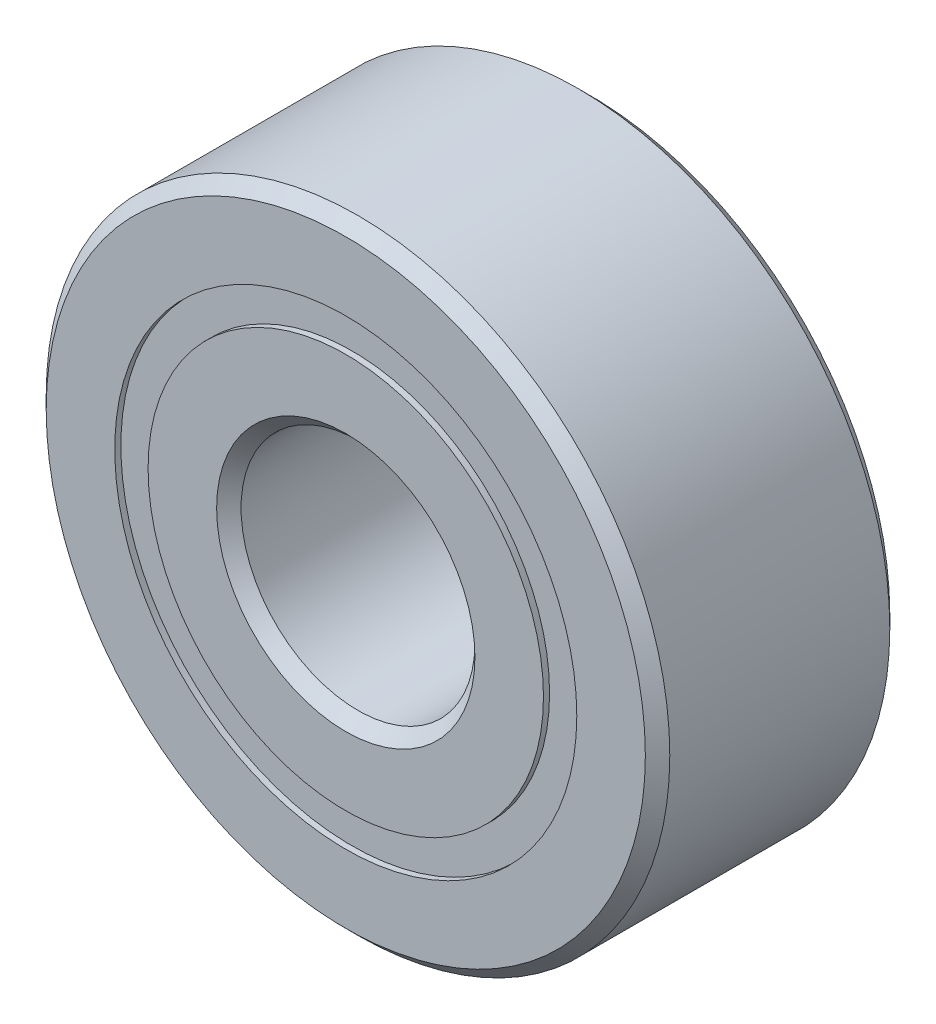
ISO-10303-21;
HEADER;
FILE_DESCRIPTION(('STEP AP214'),'2;1');
FILE_NAME('part.step','',(''),(''),'','','');
FILE_SCHEMA(('AUTOMOTIVE_DESIGN { 1 0 10303 214 1 1 1 1 }'));
ENDSEC;
DATA;
#1=APPLICATION_CONTEXT('core data for automotive mechanical design processes');
#2=APPLICATION_PROTOCOL_DEFINITION('international standard','automotive_design',2000,#1);
#3=PRODUCT_CONTEXT('',#1,'mechanical');
#4=PRODUCT('Part','Part','',(#3));
#5=PRODUCT_RELATED_PRODUCT_CATEGORY('part','',(#4));
#6=PRODUCT_DEFINITION_FORMATION('','',#4);
#7=PRODUCT_DEFINITION_CONTEXT('part definition',#1,'design');
#8=PRODUCT_DEFINITION('design','',#6,#7);
#9=PRODUCT_DEFINITION_SHAPE('','',#8);
#10=(LENGTH_UNIT() NAMED_UNIT(*) SI_UNIT(.MILLI.,.METRE.));
#11=(NAMED_UNIT(*) PLANE_ANGLE_UNIT() SI_UNIT($,.RADIAN.));
#12=(NAMED_UNIT(*) SI_UNIT($,.STERADIAN.) SOLID_ANGLE_UNIT());
#13=UNCERTAINTY_MEASURE_WITH_UNIT(LENGTH_MEASURE(1.E-05),#10,'distance_accuracy_value','');
#14=(GEOMETRIC_REPRESENTATION_CONTEXT(3) GLOBAL_UNCERTAINTY_ASSIGNED_CONTEXT((#13)) GLOBAL_UNIT_ASSIGNED_CONTEXT((#10,
#11,#12)) REPRESENTATION_CONTEXT('',''));
#15=CARTESIAN_POINT('',(0.,0.,0.));
#16=DIRECTION('',(0.,0.,1.));
#17=DIRECTION('',(1.,0.,0.));
#18=AXIS2_PLACEMENT_3D('',#15,#16,#17);
#19=CARTESIAN_POINT('',(0.,4.70503598901099,-2.36474000000001));
#20=DIRECTION('',(0.,0.,1.));
#21=DIRECTION('',(1.,0.,0.));
#22=AXIS2_PLACEMENT_3D('',#19,#20,#21);
#23=PLANE('',#22);
#24=CARTESIAN_POINT('',(0.,0.,-2.36474000000001));
#25=DIRECTION('',(0.,0.,1.));
#26=DIRECTION('',(1.,0.,0.));
#27=AXIS2_PLACEMENT_3D('',#24,#25,#26);
#28=CIRCLE('',#27,4.70503598901099);
#29=CARTESIAN_POINT('',(4.70503598901099,0.,-2.36474000000001));
#30=VERTEX_POINT('',#29);
#31=EDGE_CURVE('E55',#30,#30,#28,.T.);
#32=ORIENTED_EDGE('',*,*,#31,.F.);
#33=EDGE_LOOP('',(#32));
#34=FACE_BOUND('',#33,.T.);
#35=CARTESIAN_POINT('',(0.,0.,-2.36474000000001));
#36=DIRECTION('',(0.,0.,1.));
#37=DIRECTION('',(1.,0.,0.));
#38=AXIS2_PLACEMENT_3D('',#35,#36,#37);
#39=CIRCLE('',#38,4.02621401098901);
#40=CARTESIAN_POINT('',(4.02621401098901,0.,-2.36474000000001));
#41=VERTEX_POINT('',#40);
#42=EDGE_CURVE('E11',#41,#41,#39,.T.);
#43=ORIENTED_EDGE('',*,*,#42,.T.);
#44=EDGE_LOOP('',(#43));
#45=FACE_BOUND('',#44,.T.);
#46=ADVANCED_FACE('F41',(#34,#45),#23,.F.);
#47=CARTESIAN_POINT('',(0.,0.,2.4892));
#48=DIRECTION('',(0.,0.,1.));
#49=DIRECTION('',(1.,0.,0.));
#50=AXIS2_PLACEMENT_3D('',#47,#48,#49);
#51=CYLINDRICAL_SURFACE('',#50,4.02621401098901);
#52=ORIENTED_EDGE('',*,*,#42,.F.);
#53=EDGE_LOOP('',(#52));
#54=FACE_BOUND('',#53,.T.);
#55=CARTESIAN_POINT('',(0.,0.,-1.15720529467736));
#56=DIRECTION('',(0.,0.,1.));
#57=DIRECTION('',(1.,0.,0.));
#58=AXIS2_PLACEMENT_3D('',#55,#56,#57);
#59=CIRCLE('',#58,4.02621401098901);
#60=CARTESIAN_POINT('',(4.02621401098901,0.,-1.15720529467736));
#61=VERTEX_POINT('',#60);
#62=EDGE_CURVE('E47',#61,#61,#59,.T.);
#63=ORIENTED_EDGE('',*,*,#62,.T.);
#64=EDGE_LOOP('',(#63));
#65=FACE_BOUND('',#64,.T.);
#66=ADVANCED_FACE('F64',(#54,#65),#51,.F.);
#67=CARTESIAN_POINT('',(0.,4.70503598901099,-1.15720529467736));
#68=DIRECTION('',(0.,0.,-1.));
#69=DIRECTION('',(-1.,0.,0.));
#70=AXIS2_PLACEMENT_3D('',#67,#68,#69);
#71=PLANE('',#70);
#72=ORIENTED_EDGE('',*,*,#62,.F.);
#73=EDGE_LOOP('',(#72));
#74=FACE_BOUND('',#73,.T.);
#75=CARTESIAN_POINT('',(0.,0.,-1.15720529467736));
#76=DIRECTION('',(0.,0.,1.));
#77=DIRECTION('',(1.,0.,0.));
#78=AXIS2_PLACEMENT_3D('',#75,#76,#77);
#79=CIRCLE('',#78,4.70503598901099);
#80=CARTESIAN_POINT('',(4.70503598901099,0.,-1.15720529467736));
#81=VERTEX_POINT('',#80);
#82=EDGE_CURVE('E51',#81,#81,#79,.T.);
#83=ORIENTED_EDGE('',*,*,#82,.T.);
#84=EDGE_LOOP('',(#83));
#85=FACE_BOUND('',#84,.T.);
#86=ADVANCED_FACE('F68',(#74,#85),#71,.F.);
#87=CARTESIAN_POINT('',(0.,0.,2.4892));
#88=DIRECTION('',(0.,0.,1.));
#89=DIRECTION('',(1.,0.,0.));
#90=AXIS2_PLACEMENT_3D('',#87,#88,#89);
#91=CYLINDRICAL_SURFACE('',#90,4.70503598901099);
#92=ORIENTED_EDGE('',*,*,#82,.F.);
#93=EDGE_LOOP('',(#92));
#94=FACE_BOUND('',#93,.T.);
#95=ORIENTED_EDGE('',*,*,#31,.T.);
#96=EDGE_LOOP('',(#95));
#97=FACE_BOUND('',#96,.T.);
#98=ADVANCED_FACE('F61',(#94,#97),#91,.T.);
#99=CLOSED_SHELL('',(#46,#66,#86,#98));
#100=MANIFOLD_SOLID_BREP('B2',#99);
#101=CARTESIAN_POINT('',(0.,4.70503598901099,2.36474));
#102=DIRECTION('',(0.,0.,-1.));
#103=DIRECTION('',(-1.,0.,0.));
#104=AXIS2_PLACEMENT_3D('',#101,#102,#103);
#105=PLANE('',#104);
#106=CARTESIAN_POINT('',(0.,0.,2.36474));
#107=DIRECTION('',(0.,0.,1.));
#108=DIRECTION('',(1.,0.,0.));
#109=AXIS2_PLACEMENT_3D('',#106,#107,#108);
#110=CIRCLE('',#109,4.02621401098901);
#111=CARTESIAN_POINT('',(4.02621401098901,0.,2.36474));
#112=VERTEX_POINT('',#111);
#113=EDGE_CURVE('E40',#112,#112,#110,.T.);
#114=ORIENTED_EDGE('',*,*,#113,.F.);
#115=EDGE_LOOP('',(#114));
#116=FACE_BOUND('',#115,.T.);
#117=CARTESIAN_POINT('',(0.,0.,2.36474));
#118=DIRECTION('',(0.,0.,1.));
#119=DIRECTION('',(1.,0.,0.));
#120=AXIS2_PLACEMENT_3D('',#117,#118,#119);
#121=CIRCLE('',#120,4.70503598901099);
#122=CARTESIAN_POINT('',(4.70503598901099,0.,2.36474));
#123=VERTEX_POINT('',#122);
#124=EDGE_CURVE('E122',#123,#123,#121,.T.);
#125=ORIENTED_EDGE('',*,*,#124,.T.);
#126=EDGE_LOOP('',(#125));
#127=FACE_BOUND('',#126,.T.);
#128=ADVANCED_FACE('F108',(#116,#127),#105,.F.);
#129=CARTESIAN_POINT('',(0.,0.,2.4892));
#130=DIRECTION('',(0.,0.,1.));
#131=DIRECTION('',(1.,0.,0.));
#132=AXIS2_PLACEMENT_3D('',#129,#130,#131);
#133=CYLINDRICAL_SURFACE('',#132,4.02621401098901);
#134=CARTESIAN_POINT('',(0.,0.,1.15720529467736));
#135=DIRECTION('',(0.,0.,1.));
#136=DIRECTION('',(1.,0.,0.));
#137=AXIS2_PLACEMENT_3D('',#134,#135,#136);
#138=CIRCLE('',#137,4.02621401098901);
#139=CARTESIAN_POINT('',(4.02621401098901,0.,1.15720529467736));
#140=VERTEX_POINT('',#139);
#141=EDGE_CURVE('E114',#140,#140,#138,.T.);
#142=ORIENTED_EDGE('',*,*,#141,.F.);
#143=EDGE_LOOP('',(#142));
#144=FACE_BOUND('',#143,.T.);
#145=ORIENTED_EDGE('',*,*,#113,.T.);
#146=EDGE_LOOP('',(#145));
#147=FACE_BOUND('',#146,.T.);
#148=ADVANCED_FACE('F137',(#144,#147),#133,.F.);
#149=CARTESIAN_POINT('',(0.,4.70503598901099,1.15720529467736));
#150=DIRECTION('',(0.,0.,1.));
#151=DIRECTION('',(1.,0.,0.));
#152=AXIS2_PLACEMENT_3D('',#149,#150,#151);
#153=PLANE('',#152);
#154=CARTESIAN_POINT('',(0.,0.,1.15720529467736));
#155=DIRECTION('',(0.,0.,1.));
#156=DIRECTION('',(1.,0.,0.));
#157=AXIS2_PLACEMENT_3D('',#154,#155,#156);
#158=CIRCLE('',#157,4.70503598901099);
#159=CARTESIAN_POINT('',(4.70503598901099,0.,1.15720529467736));
#160=VERTEX_POINT('',#159);
#161=EDGE_CURVE('E118',#160,#160,#158,.T.);
#162=ORIENTED_EDGE('',*,*,#161,.F.);
#163=EDGE_LOOP('',(#162));
#164=FACE_BOUND('',#163,.T.);
#165=ORIENTED_EDGE('',*,*,#141,.T.);
#166=EDGE_LOOP('',(#165));
#167=FACE_BOUND('',#166,.T.);
#168=ADVANCED_FACE('F132',(#164,#167),#153,.F.);
#169=CARTESIAN_POINT('',(0.,0.,2.4892));
#170=DIRECTION('',(0.,0.,1.));
#171=DIRECTION('',(1.,0.,0.));
#172=AXIS2_PLACEMENT_3D('',#169,#170,#171);
#173=CYLINDRICAL_SURFACE('',#172,4.70503598901099);
#174=ORIENTED_EDGE('',*,*,#124,.F.);
#175=EDGE_LOOP('',(#174));
#176=FACE_BOUND('',#175,.T.);
#177=ORIENTED_EDGE('',*,*,#161,.T.);
#178=EDGE_LOOP('',(#177));
#179=FACE_BOUND('',#178,.T.);
#180=ADVANCED_FACE('F129',(#176,#179),#173,.T.);
#181=CLOSED_SHELL('',(#128,#148,#168,#180));
#182=MANIFOLD_SOLID_BREP('B6',#181);
#183=CARTESIAN_POINT('',(-3.08696304161748,3.08696304161756,0.));
#184=DIRECTION('',(0.,0.,1.));
#185=DIRECTION('',(-0.707106781186539,0.707106781186556,0.));
#186=AXIS2_PLACEMENT_3D('',#183,#184,#185);
#187=SPHERICAL_SURFACE('',#186,1.15720529467736);
#188=CARTESIAN_POINT('',(-3.08696304161748,3.08696304161756,1.15720529467736));
#189=VERTEX_POINT('',#188);
#190=VERTEX_LOOP('',#189);
#191=FACE_BOUND('',#190,.T.);
#192=ADVANCED_FACE('F175',(#191),#187,.T.);
#193=CLOSED_SHELL('',(#192));
#194=MANIFOLD_SOLID_BREP('B35',#193);
#195=CARTESIAN_POINT('',(-4.365625,0.,0.));
#196=DIRECTION('',(0.,0.,1.));
#197=DIRECTION('',(-1.,0.,0.));
#198=AXIS2_PLACEMENT_3D('',#195,#196,#197);
#199=SPHERICAL_SURFACE('',#198,1.15720529467736);
#200=CARTESIAN_POINT('',(-4.365625,0.,1.15720529467736));
#201=VERTEX_POINT('',#200);
#202=VERTEX_LOOP('',#201);
#203=FACE_BOUND('',#202,.T.);
#204=ADVANCED_FACE('F195',(#203),#199,.T.);
#205=CLOSED_SHELL('',(#204));
#206=MANIFOLD_SOLID_BREP('B104',#205);
#207=CARTESIAN_POINT('',(-3.08696304161755,-3.0869630416175,0.));
#208=DIRECTION('',(0.,0.,1.));
#209=DIRECTION('',(-0.707106781186554,-0.707106781186541,0.));
#210=AXIS2_PLACEMENT_3D('',#207,#208,#209);
#211=SPHERICAL_SURFACE('',#210,1.15720529467736);
#212=CARTESIAN_POINT('',(-3.08696304161755,-3.0869630416175,1.15720529467736));
#213=VERTEX_POINT('',#212);
#214=VERTEX_LOOP('',#213);
#215=FACE_BOUND('',#214,.T.);
#216=ADVANCED_FACE('F215',(#215),#211,.T.);
#217=CLOSED_SHELL('',(#216));
#218=MANIFOLD_SOLID_BREP('B171',#217);
#219=CARTESIAN_POINT('',(0.,-4.365625,0.));
#220=DIRECTION('',(0.,0.,1.));
#221=DIRECTION('',(0.,-1.,0.));
#222=AXIS2_PLACEMENT_3D('',#219,#220,#221);
#223=SPHERICAL_SURFACE('',#222,1.15720529467736);
#224=CARTESIAN_POINT('',(0.,-4.365625,1.15720529467736));
#225=VERTEX_POINT('',#224);
#226=VERTEX_LOOP('',#225);
#227=FACE_BOUND('',#226,.T.);
#228=ADVANCED_FACE('F235',(#227),#223,.T.);
#229=CLOSED_SHELL('',(#228));
#230=MANIFOLD_SOLID_BREP('B191',#229);
#231=CARTESIAN_POINT('',(3.08696304161751,-3.08696304161754,0.));
#232=DIRECTION('',(0.,0.,1.));
#233=DIRECTION('',(0.707106781186544,-0.707106781186551,0.));
#234=AXIS2_PLACEMENT_3D('',#231,#232,#233);
#235=SPHERICAL_SURFACE('',#234,1.15720529467736);
#236=CARTESIAN_POINT('',(3.08696304161751,-3.08696304161754,1.15720529467736));
#237=VERTEX_POINT('',#236);
#238=VERTEX_LOOP('',#237);
#239=FACE_BOUND('',#238,.T.);
#240=ADVANCED_FACE('F255',(#239),#235,.T.);
#241=CLOSED_SHELL('',(#240));
#242=MANIFOLD_SOLID_BREP('B211',#241);
#243=CARTESIAN_POINT('',(4.365625,0.,0.));
#244=DIRECTION('',(0.,0.,1.));
#245=DIRECTION('',(1.,0.,0.));
#246=AXIS2_PLACEMENT_3D('',#243,#244,#245);
#247=SPHERICAL_SURFACE('',#246,1.15720529467736);
#248=CARTESIAN_POINT('',(4.365625,0.,1.15720529467736));
#249=VERTEX_POINT('',#248);
#250=VERTEX_LOOP('',#249);
#251=FACE_BOUND('',#250,.T.);
#252=ADVANCED_FACE('F275',(#251),#247,.T.);
#253=CLOSED_SHELL('',(#252));
#254=MANIFOLD_SOLID_BREP('B231',#253);
#255=CARTESIAN_POINT('',(3.08696304161753,3.08696304161752,0.));
#256=DIRECTION('',(0.,0.,1.));
#257=DIRECTION('',(0.707106781186549,0.707106781186546,0.));
#258=AXIS2_PLACEMENT_3D('',#255,#256,#257);
#259=SPHERICAL_SURFACE('',#258,1.15720529467736);
#260=CARTESIAN_POINT('',(3.08696304161753,3.08696304161752,1.15720529467736));
#261=VERTEX_POINT('',#260);
#262=VERTEX_LOOP('',#261);
#263=FACE_BOUND('',#262,.T.);
#264=ADVANCED_FACE('F295',(#263),#259,.T.);
#265=CLOSED_SHELL('',(#264));
#266=MANIFOLD_SOLID_BREP('B251',#265);
#267=CARTESIAN_POINT('',(0.,4.365625,0.));
#268=DIRECTION('',(0.,0.,1.));
#269=DIRECTION('',(0.,1.,0.));
#270=AXIS2_PLACEMENT_3D('',#267,#268,#269);
#271=SPHERICAL_SURFACE('',#270,1.15720529467736);
#272=CARTESIAN_POINT('',(0.,4.365625,1.15720529467736));
#273=VERTEX_POINT('',#272);
#274=VERTEX_LOOP('',#273);
#275=FACE_BOUND('',#274,.T.);
#276=ADVANCED_FACE('F317',(#275),#271,.T.);
#277=CLOSED_SHELL('',(#276));
#278=MANIFOLD_SOLID_BREP('B271',#277);
#279=CARTESIAN_POINT('',(0.,4.02621401098901,2.4892));
#280=DIRECTION('',(0.,0.,-1.));
#281=DIRECTION('',(-1.,0.,0.));
#282=AXIS2_PLACEMENT_3D('',#279,#280,#281);
#283=PLANE('',#282);
#284=CARTESIAN_POINT('',(0.,0.,2.4892));
#285=DIRECTION('',(0.,0.,1.));
#286=DIRECTION('',(1.,0.,0.));
#287=AXIS2_PLACEMENT_3D('',#284,#285,#286);
#288=CIRCLE('',#287,2.63017);
#289=CARTESIAN_POINT('',(2.63017,0.,2.4892));
#290=VERTEX_POINT('',#289);
#291=EDGE_CURVE('E364',#290,#290,#288,.T.);
#292=ORIENTED_EDGE('',*,*,#291,.F.);
#293=EDGE_LOOP('',(#292));
#294=FACE_BOUND('',#293,.T.);
#295=CARTESIAN_POINT('',(0.,0.,2.4892));
#296=DIRECTION('',(0.,0.,1.));
#297=DIRECTION('',(1.,0.,0.));
#298=AXIS2_PLACEMENT_3D('',#295,#296,#297);
#299=CIRCLE('',#298,4.02621401098901);
#300=CARTESIAN_POINT('',(4.02621401098901,0.,2.4892));
#301=VERTEX_POINT('',#300);
#302=EDGE_CURVE('E316',#301,#301,#299,.T.);
#303=ORIENTED_EDGE('',*,*,#302,.T.);
#304=EDGE_LOOP('',(#303));
#305=FACE_BOUND('',#304,.T.);
#306=ADVANCED_FACE('F336',(#294,#305),#283,.F.);
#307=CARTESIAN_POINT('',(0.,0.,2.4892));
#308=DIRECTION('',(0.,0.,1.));
#309=DIRECTION('',(1.,0.,0.));
#310=AXIS2_PLACEMENT_3D('',#307,#308,#309);
#311=CYLINDRICAL_SURFACE('',#310,4.02621401098901);
#312=ORIENTED_EDGE('',*,*,#302,.F.);
#313=EDGE_LOOP('',(#312));
#314=FACE_BOUND('',#313,.T.);
#315=CARTESIAN_POINT('',(0.,0.,1.10631111111111));
#316=DIRECTION('',(0.,0.,1.));
#317=DIRECTION('',(1.,0.,0.));
#318=AXIS2_PLACEMENT_3D('',#315,#316,#317);
#319=CIRCLE('',#318,4.02621401098901);
#320=CARTESIAN_POINT('',(4.02621401098901,0.,1.10631111111111));
#321=VERTEX_POINT('',#320);
#322=EDGE_CURVE('E342',#321,#321,#319,.T.);
#323=ORIENTED_EDGE('',*,*,#322,.T.);
#324=EDGE_LOOP('',(#323));
#325=FACE_BOUND('',#324,.T.);
#326=ADVANCED_FACE('F371',(#314,#325),#311,.T.);
#327=CARTESIAN_POINT('',(0.,0.,0.));
#328=DIRECTION('',(0.,0.,1.));
#329=DIRECTION('',(1.,0.,0.));
#330=AXIS2_PLACEMENT_3D('',#327,#328,#329);
#331=TOROIDAL_SURFACE('',#330,4.36562499999999,1.15720529467736);
#332=ORIENTED_EDGE('',*,*,#322,.F.);
#333=EDGE_LOOP('',(#332));
#334=FACE_BOUND('',#333,.T.);
#335=CARTESIAN_POINT('',(0.,0.,-1.10631111111111));
#336=DIRECTION('',(0.,0.,1.));
#337=DIRECTION('',(1.,0.,0.));
#338=AXIS2_PLACEMENT_3D('',#335,#336,#337);
#339=CIRCLE('',#338,4.02621401098901);
#340=CARTESIAN_POINT('',(4.02621401098901,0.,-1.10631111111111));
#341=VERTEX_POINT('',#340);
#342=EDGE_CURVE('E346',#341,#341,#339,.T.);
#343=ORIENTED_EDGE('',*,*,#342,.T.);
#344=EDGE_LOOP('',(#343));
#345=FACE_BOUND('',#344,.T.);
#346=ADVANCED_FACE('F375',(#334,#345),#331,.F.);
#347=CARTESIAN_POINT('',(0.,0.,2.4892));
#348=DIRECTION('',(0.,0.,1.));
#349=DIRECTION('',(1.,0.,0.));
#350=AXIS2_PLACEMENT_3D('',#347,#348,#349);
#351=CYLINDRICAL_SURFACE('',#350,4.02621401098901);
#352=ORIENTED_EDGE('',*,*,#342,.F.);
#353=EDGE_LOOP('',(#352));
#354=FACE_BOUND('',#353,.T.);
#355=CARTESIAN_POINT('',(0.,0.,-2.4892));
#356=DIRECTION('',(0.,0.,1.));
#357=DIRECTION('',(1.,0.,0.));
#358=AXIS2_PLACEMENT_3D('',#355,#356,#357);
#359=CIRCLE('',#358,4.02621401098901);
#360=CARTESIAN_POINT('',(4.02621401098901,0.,-2.4892));
#361=VERTEX_POINT('',#360);
#362=EDGE_CURVE('E350',#361,#361,#359,.T.);
#363=ORIENTED_EDGE('',*,*,#362,.T.);
#364=EDGE_LOOP('',(#363));
#365=FACE_BOUND('',#364,.T.);
#366=ADVANCED_FACE('F380',(#354,#365),#351,.T.);
#367=CARTESIAN_POINT('',(0.,2.63017,-2.48920000000001));
#368=DIRECTION('',(0.,0.,1.));
#369=DIRECTION('',(1.,0.,0.));
#370=AXIS2_PLACEMENT_3D('',#367,#368,#369);
#371=PLANE('',#370);
#372=ORIENTED_EDGE('',*,*,#362,.F.);
#373=EDGE_LOOP('',(#372));
#374=FACE_BOUND('',#373,.T.);
#375=CARTESIAN_POINT('',(0.,0.,-2.48920000000001));
#376=DIRECTION('',(0.,0.,1.));
#377=DIRECTION('',(1.,0.,0.));
#378=AXIS2_PLACEMENT_3D('',#375,#376,#377);
#379=CIRCLE('',#378,2.63017);
#380=CARTESIAN_POINT('',(2.63017,0.,-2.48920000000001));
#381=VERTEX_POINT('',#380);
#382=EDGE_CURVE('E355',#381,#381,#379,.T.);
#383=ORIENTED_EDGE('',*,*,#382,.T.);
#384=EDGE_LOOP('',(#383));
#385=FACE_BOUND('',#384,.T.);
#386=ADVANCED_FACE('F386',(#374,#385),#371,.F.);
#387=CARTESIAN_POINT('',(0.,0.,-2.24028000000001));
#388=DIRECTION('',(0.,0.,-1.));
#389=DIRECTION('',(-1.,0.,0.));
#390=AXIS2_PLACEMENT_3D('',#387,#388,#389);
#391=CONICAL_SURFACE('',#390,2.38125,0.785398163397448);
#392=ORIENTED_EDGE('',*,*,#382,.F.);
#393=EDGE_LOOP('',(#392));
#394=FACE_BOUND('',#393,.T.);
#395=CARTESIAN_POINT('',(0.,0.,-2.24028000000001));
#396=DIRECTION('',(0.,0.,1.));
#397=DIRECTION('',(1.,0.,0.));
#398=AXIS2_PLACEMENT_3D('',#395,#396,#397);
#399=CIRCLE('',#398,2.38125);
#400=CARTESIAN_POINT('',(2.38125,0.,-2.24028000000001));
#401=VERTEX_POINT('',#400);
#402=EDGE_CURVE('E358',#401,#401,#399,.T.);
#403=ORIENTED_EDGE('',*,*,#402,.T.);
#404=EDGE_LOOP('',(#403));
#405=FACE_BOUND('',#404,.T.);
#406=ADVANCED_FACE('F390',(#394,#405),#391,.F.);
#407=CARTESIAN_POINT('',(0.,0.,2.4892));
#408=DIRECTION('',(0.,0.,1.));
#409=DIRECTION('',(1.,0.,0.));
#410=AXIS2_PLACEMENT_3D('',#407,#408,#409);
#411=CYLINDRICAL_SURFACE('',#410,2.38125);
#412=ORIENTED_EDGE('',*,*,#402,.F.);
#413=EDGE_LOOP('',(#412));
#414=FACE_BOUND('',#413,.T.);
#415=CARTESIAN_POINT('',(0.,0.,2.24028));
#416=DIRECTION('',(0.,0.,1.));
#417=DIRECTION('',(1.,0.,0.));
#418=AXIS2_PLACEMENT_3D('',#415,#416,#417);
#419=CIRCLE('',#418,2.38125);
#420=CARTESIAN_POINT('',(2.38125,0.,2.24028));
#421=VERTEX_POINT('',#420);
#422=EDGE_CURVE('E361',#421,#421,#419,.T.);
#423=ORIENTED_EDGE('',*,*,#422,.T.);
#424=EDGE_LOOP('',(#423));
#425=FACE_BOUND('',#424,.T.);
#426=ADVANCED_FACE('F394',(#414,#425),#411,.F.);
#427=CARTESIAN_POINT('',(0.,0.,2.4892));
#428=DIRECTION('',(0.,0.,1.));
#429=DIRECTION('',(1.,0.,0.));
#430=AXIS2_PLACEMENT_3D('',#427,#428,#429);
#431=CONICAL_SURFACE('',#430,2.63017,0.785398163397447);
#432=ORIENTED_EDGE('',*,*,#422,.F.);
#433=EDGE_LOOP('',(#432));
#434=FACE_BOUND('',#433,.T.);
#435=ORIENTED_EDGE('',*,*,#291,.T.);
#436=EDGE_LOOP('',(#435));
#437=FACE_BOUND('',#436,.T.);
#438=ADVANCED_FACE('F368',(#434,#437),#431,.F.);
#439=CLOSED_SHELL('',(#306,#326,#346,#366,#386,#406,#426,#438));
#440=MANIFOLD_SOLID_BREP('B291',#439);
#441=CARTESIAN_POINT('',(0.,0.,2.24028));
#442=DIRECTION('',(0.,0.,-1.));
#443=DIRECTION('',(-1.,0.,0.));
#444=AXIS2_PLACEMENT_3D('',#441,#442,#443);
#445=CONICAL_SURFACE('',#444,6.35,0.785398163397447);
#446=CARTESIAN_POINT('',(0.,0.,2.4892));
#447=DIRECTION('',(0.,0.,1.));
#448=DIRECTION('',(1.,0.,0.));
#449=AXIS2_PLACEMENT_3D('',#446,#447,#448);
#450=CIRCLE('',#449,6.10108);
#451=CARTESIAN_POINT('',(6.10108,0.,2.4892));
#452=VERTEX_POINT('',#451);
#453=EDGE_CURVE('E485',#452,#452,#450,.T.);
#454=ORIENTED_EDGE('',*,*,#453,.F.);
#455=EDGE_LOOP('',(#454));
#456=FACE_BOUND('',#455,.T.);
#457=CARTESIAN_POINT('',(0.,0.,2.24028));
#458=DIRECTION('',(0.,0.,1.));
#459=DIRECTION('',(1.,0.,0.));
#460=AXIS2_PLACEMENT_3D('',#457,#458,#459);
#461=CIRCLE('',#460,6.35);
#462=CARTESIAN_POINT('',(6.35,0.,2.24028));
#463=VERTEX_POINT('',#462);
#464=EDGE_CURVE('E335',#463,#463,#461,.T.);
#465=ORIENTED_EDGE('',*,*,#464,.T.);
#466=EDGE_LOOP('',(#465));
#467=FACE_BOUND('',#466,.T.);
#468=ADVANCED_FACE('F457',(#456,#467),#445,.T.);
#469=CARTESIAN_POINT('',(0.,0.,2.4892));
#470=DIRECTION('',(0.,0.,1.));
#471=DIRECTION('',(1.,0.,0.));
#472=AXIS2_PLACEMENT_3D('',#469,#470,#471);
#473=CYLINDRICAL_SURFACE('',#472,6.35);
#474=ORIENTED_EDGE('',*,*,#464,.F.);
#475=EDGE_LOOP('',(#474));
#476=FACE_BOUND('',#475,.T.);
#477=CARTESIAN_POINT('',(0.,0.,-2.24028000000001));
#478=DIRECTION('',(0.,0.,1.));
#479=DIRECTION('',(1.,0.,0.));
#480=AXIS2_PLACEMENT_3D('',#477,#478,#479);
#481=CIRCLE('',#480,6.35);
#482=CARTESIAN_POINT('',(6.35,0.,-2.24028000000001));
#483=VERTEX_POINT('',#482);
#484=EDGE_CURVE('E463',#483,#483,#481,.T.);
#485=ORIENTED_EDGE('',*,*,#484,.T.);
#486=EDGE_LOOP('',(#485));
#487=FACE_BOUND('',#486,.T.);
#488=ADVANCED_FACE('F492',(#476,#487),#473,.T.);
#489=CARTESIAN_POINT('',(0.,0.,-2.48920000000001));
#490=DIRECTION('',(0.,0.,1.));
#491=DIRECTION('',(1.,0.,0.));
#492=AXIS2_PLACEMENT_3D('',#489,#490,#491);
#493=CONICAL_SURFACE('',#492,6.10108,0.785398163397448);
#494=ORIENTED_EDGE('',*,*,#484,.F.);
#495=EDGE_LOOP('',(#494));
#496=FACE_BOUND('',#495,.T.);
#497=CARTESIAN_POINT('',(0.,0.,-2.48920000000001));
#498=DIRECTION('',(0.,0.,1.));
#499=DIRECTION('',(1.,0.,0.));
#500=AXIS2_PLACEMENT_3D('',#497,#498,#499);
#501=CIRCLE('',#500,6.10108);
#502=CARTESIAN_POINT('',(6.10108,0.,-2.48920000000001));
#503=VERTEX_POINT('',#502);
#504=EDGE_CURVE('E467',#503,#503,#501,.T.);
#505=ORIENTED_EDGE('',*,*,#504,.T.);
#506=EDGE_LOOP('',(#505));
#507=FACE_BOUND('',#506,.T.);
#508=ADVANCED_FACE('F496',(#496,#507),#493,.T.);
#509=CARTESIAN_POINT('',(0.,6.10108,-2.48920000000001));
#510=DIRECTION('',(0.,0.,1.));
#511=DIRECTION('',(1.,0.,0.));
#512=AXIS2_PLACEMENT_3D('',#509,#510,#511);
#513=PLANE('',#512);
#514=ORIENTED_EDGE('',*,*,#504,.F.);
#515=EDGE_LOOP('',(#514));
#516=FACE_BOUND('',#515,.T.);
#517=CARTESIAN_POINT('',(0.,0.,-2.48920000000001));
#518=DIRECTION('',(0.,0.,1.));
#519=DIRECTION('',(1.,0.,0.));
#520=AXIS2_PLACEMENT_3D('',#517,#518,#519);
#521=CIRCLE('',#520,4.70503598901099);
#522=CARTESIAN_POINT('',(4.70503598901099,0.,-2.48920000000001));
#523=VERTEX_POINT('',#522);
#524=EDGE_CURVE('E471',#523,#523,#521,.T.);
#525=ORIENTED_EDGE('',*,*,#524,.T.);
#526=EDGE_LOOP('',(#525));
#527=FACE_BOUND('',#526,.T.);
#528=ADVANCED_FACE('F501',(#516,#527),#513,.F.);
#529=CARTESIAN_POINT('',(0.,0.,2.4892));
#530=DIRECTION('',(0.,0.,1.));
#531=DIRECTION('',(1.,0.,0.));
#532=AXIS2_PLACEMENT_3D('',#529,#530,#531);
#533=CYLINDRICAL_SURFACE('',#532,4.70503598901099);
#534=ORIENTED_EDGE('',*,*,#524,.F.);
#535=EDGE_LOOP('',(#534));
#536=FACE_BOUND('',#535,.T.);
#537=CARTESIAN_POINT('',(0.,0.,-1.10631111111111));
#538=DIRECTION('',(0.,0.,1.));
#539=DIRECTION('',(1.,0.,0.));
#540=AXIS2_PLACEMENT_3D('',#537,#538,#539);
#541=CIRCLE('',#540,4.70503598901099);
#542=CARTESIAN_POINT('',(4.70503598901099,0.,-1.10631111111111));
#543=VERTEX_POINT('',#542);
#544=EDGE_CURVE('E476',#543,#543,#541,.T.);
#545=ORIENTED_EDGE('',*,*,#544,.T.);
#546=EDGE_LOOP('',(#545));
#547=FACE_BOUND('',#546,.T.);
#548=ADVANCED_FACE('F507',(#536,#547),#533,.F.);
#549=CARTESIAN_POINT('',(0.,0.,0.));
#550=DIRECTION('',(0.,0.,1.));
#551=DIRECTION('',(1.,0.,0.));
#552=AXIS2_PLACEMENT_3D('',#549,#550,#551);
#553=TOROIDAL_SURFACE('',#552,4.365625,1.15720529467736);
#554=ORIENTED_EDGE('',*,*,#544,.F.);
#555=EDGE_LOOP('',(#554));
#556=FACE_BOUND('',#555,.T.);
#557=CARTESIAN_POINT('',(0.,0.,1.10631111111111));
#558=DIRECTION('',(0.,0.,1.));
#559=DIRECTION('',(1.,0.,0.));
#560=AXIS2_PLACEMENT_3D('',#557,#558,#559);
#561=CIRCLE('',#560,4.70503598901099);
#562=CARTESIAN_POINT('',(4.70503598901099,0.,1.10631111111111));
#563=VERTEX_POINT('',#562);
#564=EDGE_CURVE('E479',#563,#563,#561,.T.);
#565=ORIENTED_EDGE('',*,*,#564,.T.);
#566=EDGE_LOOP('',(#565));
#567=FACE_BOUND('',#566,.T.);
#568=ADVANCED_FACE('F511',(#556,#567),#553,.F.);
#569=CARTESIAN_POINT('',(0.,0.,2.4892));
#570=DIRECTION('',(0.,0.,1.));
#571=DIRECTION('',(1.,0.,0.));
#572=AXIS2_PLACEMENT_3D('',#569,#570,#571);
#573=CYLINDRICAL_SURFACE('',#572,4.70503598901099);
#574=ORIENTED_EDGE('',*,*,#564,.F.);
#575=EDGE_LOOP('',(#574));
#576=FACE_BOUND('',#575,.T.);
#577=CARTESIAN_POINT('',(0.,0.,2.4892));
#578=DIRECTION('',(0.,0.,1.));
#579=DIRECTION('',(1.,0.,0.));
#580=AXIS2_PLACEMENT_3D('',#577,#578,#579);
#581=CIRCLE('',#580,4.70503598901099);
#582=CARTESIAN_POINT('',(4.70503598901099,0.,2.4892));
#583=VERTEX_POINT('',#582);
#584=EDGE_CURVE('E482',#583,#583,#581,.T.);
#585=ORIENTED_EDGE('',*,*,#584,.T.);
#586=EDGE_LOOP('',(#585));
#587=FACE_BOUND('',#586,.T.);
#588=ADVANCED_FACE('F515',(#576,#587),#573,.F.);
#589=CARTESIAN_POINT('',(0.,6.10108,2.4892));
#590=DIRECTION('',(0.,0.,-1.));
#591=DIRECTION('',(-1.,0.,0.));
#592=AXIS2_PLACEMENT_3D('',#589,#590,#591);
#593=PLANE('',#592);
#594=ORIENTED_EDGE('',*,*,#584,.F.);
#595=EDGE_LOOP('',(#594));
#596=FACE_BOUND('',#595,.T.);
#597=ORIENTED_EDGE('',*,*,#453,.T.);
#598=EDGE_LOOP('',(#597));
#599=FACE_BOUND('',#598,.T.);
#600=ADVANCED_FACE('F489',(#596,#599),#593,.F.);
#601=CLOSED_SHELL('',(#468,#488,#508,#528,#548,#568,#588,#600));
#602=MANIFOLD_SOLID_BREP('B311',#601);
#603=ADVANCED_BREP_SHAPE_REPRESENTATION('',(#18,#100,#182,#194,#206,#218,#230,#242,#254,#266,
#278,#440,#602),#14);
#604=SHAPE_DEFINITION_REPRESENTATION(#9,#603);
ENDSEC;
END-ISO-10303-21;
